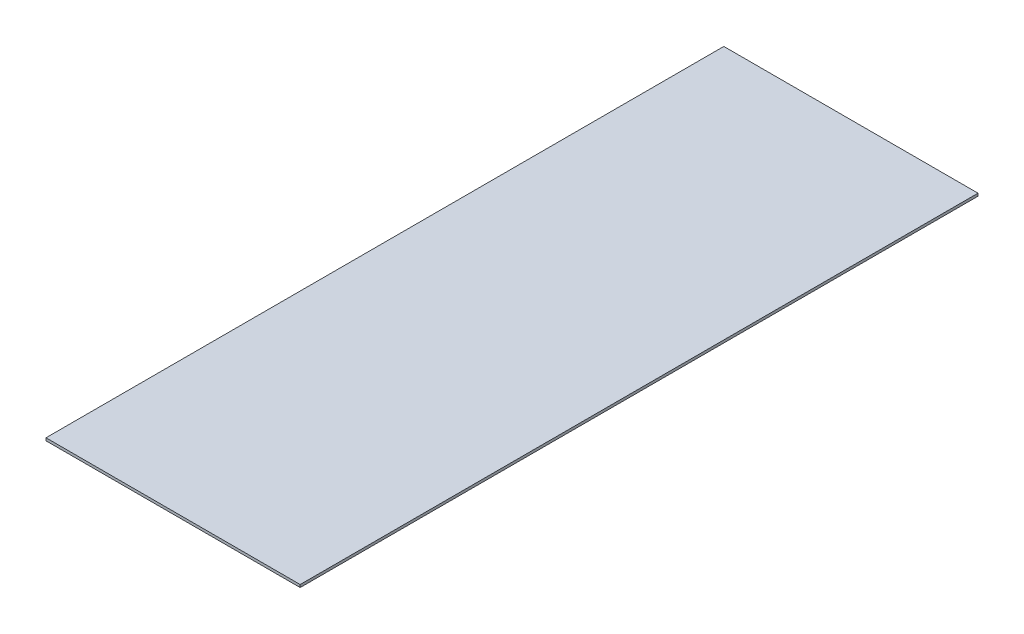
ISO-10303-21;
HEADER;
FILE_DESCRIPTION(('STEP AP214'),'2;1');
FILE_NAME('part.step','',(''),(''),'','','');
FILE_SCHEMA(('AUTOMOTIVE_DESIGN { 1 0 10303 214 1 1 1 1 }'));
ENDSEC;
DATA;
#1=APPLICATION_CONTEXT('core data for automotive mechanical design processes');
#2=APPLICATION_PROTOCOL_DEFINITION('international standard','automotive_design',2000,#1);
#3=PRODUCT_CONTEXT('',#1,'mechanical');
#4=PRODUCT('Part','Part','',(#3));
#5=PRODUCT_RELATED_PRODUCT_CATEGORY('part','',(#4));
#6=PRODUCT_DEFINITION_FORMATION('','',#4);
#7=PRODUCT_DEFINITION_CONTEXT('part definition',#1,'design');
#8=PRODUCT_DEFINITION('design','',#6,#7);
#9=PRODUCT_DEFINITION_SHAPE('','',#8);
#10=(LENGTH_UNIT() NAMED_UNIT(*) SI_UNIT(.MILLI.,.METRE.));
#11=(NAMED_UNIT(*) PLANE_ANGLE_UNIT() SI_UNIT($,.RADIAN.));
#12=(NAMED_UNIT(*) SI_UNIT($,.STERADIAN.) SOLID_ANGLE_UNIT());
#13=UNCERTAINTY_MEASURE_WITH_UNIT(LENGTH_MEASURE(1.E-05),#10,'distance_accuracy_value','');
#14=(GEOMETRIC_REPRESENTATION_CONTEXT(3) GLOBAL_UNCERTAINTY_ASSIGNED_CONTEXT((#13)) GLOBAL_UNIT_ASSIGNED_CONTEXT((#10,
#11,#12)) REPRESENTATION_CONTEXT('',''));
#15=CARTESIAN_POINT('',(0.,0.,0.));
#16=DIRECTION('',(0.,0.,1.));
#17=DIRECTION('',(1.,0.,0.));
#18=AXIS2_PLACEMENT_3D('',#15,#16,#17);
#19=CARTESIAN_POINT('',(457.2,9.5,1219.2));
#20=DIRECTION('',(-1.,0.,0.));
#21=DIRECTION('',(0.,0.,1.));
#22=AXIS2_PLACEMENT_3D('',#19,#20,#21);
#23=PLANE('',#22);
#24=DIRECTION('',(0.,0.,-1.));
#25=VECTOR('',#24,1.);
#26=CARTESIAN_POINT('',(457.2,0.,1219.2));
#27=LINE('',#26,#25);
#28=CARTESIAN_POINT('',(457.2,0.,1219.2));
#29=VERTEX_POINT('',#28);
#30=CARTESIAN_POINT('',(457.2,0.,-1219.2));
#31=VERTEX_POINT('',#30);
#32=EDGE_CURVE('E96',#29,#31,#27,.T.);
#33=ORIENTED_EDGE('',*,*,#32,.T.);
#34=DIRECTION('',(0.,-1.,0.));
#35=VECTOR('',#34,1.);
#36=CARTESIAN_POINT('',(457.2,9.5,-1219.2));
#37=LINE('',#36,#35);
#38=CARTESIAN_POINT('',(457.2,9.5,-1219.2));
#39=VERTEX_POINT('',#38);
#40=EDGE_CURVE('E11',#39,#31,#37,.T.);
#41=ORIENTED_EDGE('',*,*,#40,.F.);
#42=DIRECTION('',(0.,0.,-1.));
#43=VECTOR('',#42,1.);
#44=CARTESIAN_POINT('',(457.2,9.5,1219.2));
#45=LINE('',#44,#43);
#46=CARTESIAN_POINT('',(457.2,9.5,1219.2));
#47=VERTEX_POINT('',#46);
#48=EDGE_CURVE('E84',#47,#39,#45,.T.);
#49=ORIENTED_EDGE('',*,*,#48,.F.);
#50=DIRECTION('',(0.,-1.,0.));
#51=VECTOR('',#50,1.);
#52=CARTESIAN_POINT('',(457.2,9.5,1219.2));
#53=LINE('',#52,#51);
#54=EDGE_CURVE('E92',#47,#29,#53,.T.);
#55=ORIENTED_EDGE('',*,*,#54,.T.);
#56=EDGE_LOOP('',(#33,#41,#49,#55));
#57=FACE_BOUND('',#56,.T.);
#58=ADVANCED_FACE('F33',(#57),#23,.F.);
#59=CARTESIAN_POINT('',(-457.2,9.5,-1219.2));
#60=DIRECTION('',(0.,0.,1.));
#61=DIRECTION('',(1.,0.,0.));
#62=AXIS2_PLACEMENT_3D('',#59,#60,#61);
#63=PLANE('',#62);
#64=DIRECTION('',(-1.,0.,0.));
#65=VECTOR('',#64,1.);
#66=CARTESIAN_POINT('',(-457.2,0.,-1219.2));
#67=LINE('',#66,#65);
#68=CARTESIAN_POINT('',(-457.2,0.,-1219.2));
#69=VERTEX_POINT('',#68);
#70=EDGE_CURVE('E88',#31,#69,#67,.T.);
#71=ORIENTED_EDGE('',*,*,#70,.T.);
#72=DIRECTION('',(0.,-1.,0.));
#73=VECTOR('',#72,1.);
#74=CARTESIAN_POINT('',(-457.2,9.5,-1219.2));
#75=LINE('',#74,#73);
#76=CARTESIAN_POINT('',(-457.2,9.5,-1219.2));
#77=VERTEX_POINT('',#76);
#78=EDGE_CURVE('E41',#77,#69,#75,.T.);
#79=ORIENTED_EDGE('',*,*,#78,.F.);
#80=DIRECTION('',(-1.,0.,0.));
#81=VECTOR('',#80,1.);
#82=CARTESIAN_POINT('',(-457.2,9.5,-1219.2));
#83=LINE('',#82,#81);
#84=EDGE_CURVE('E79',#39,#77,#83,.T.);
#85=ORIENTED_EDGE('',*,*,#84,.F.);
#86=ORIENTED_EDGE('',*,*,#40,.T.);
#87=EDGE_LOOP('',(#71,#79,#85,#86));
#88=FACE_BOUND('',#87,.T.);
#89=ADVANCED_FACE('F87',(#88),#63,.F.);
#90=CARTESIAN_POINT('',(-457.2,9.5,1219.2));
#91=DIRECTION('',(1.,0.,0.));
#92=DIRECTION('',(0.,0.,-1.));
#93=AXIS2_PLACEMENT_3D('',#90,#91,#92);
#94=PLANE('',#93);
#95=DIRECTION('',(0.,0.,1.));
#96=VECTOR('',#95,1.);
#97=CARTESIAN_POINT('',(-457.2,0.,1219.2));
#98=LINE('',#97,#96);
#99=CARTESIAN_POINT('',(-457.2,0.,1219.2));
#100=VERTEX_POINT('',#99);
#101=EDGE_CURVE('E66',#69,#100,#98,.T.);
#102=ORIENTED_EDGE('',*,*,#101,.T.);
#103=DIRECTION('',(0.,-1.,0.));
#104=VECTOR('',#103,1.);
#105=CARTESIAN_POINT('',(-457.2,9.5,1219.2));
#106=LINE('',#105,#104);
#107=CARTESIAN_POINT('',(-457.2,9.5,1219.2));
#108=VERTEX_POINT('',#107);
#109=EDGE_CURVE('E89',#108,#100,#106,.T.);
#110=ORIENTED_EDGE('',*,*,#109,.F.);
#111=DIRECTION('',(0.,0.,1.));
#112=VECTOR('',#111,1.);
#113=CARTESIAN_POINT('',(-457.2,9.5,1219.2));
#114=LINE('',#113,#112);
#115=EDGE_CURVE('E82',#77,#108,#114,.T.);
#116=ORIENTED_EDGE('',*,*,#115,.F.);
#117=ORIENTED_EDGE('',*,*,#78,.T.);
#118=EDGE_LOOP('',(#102,#110,#116,#117));
#119=FACE_BOUND('',#118,.T.);
#120=ADVANCED_FACE('F90',(#119),#94,.F.);
#121=CARTESIAN_POINT('',(-457.2,9.5,1219.2));
#122=DIRECTION('',(0.,0.,-1.));
#123=DIRECTION('',(-1.,0.,0.));
#124=AXIS2_PLACEMENT_3D('',#121,#122,#123);
#125=PLANE('',#124);
#126=DIRECTION('',(1.,0.,0.));
#127=VECTOR('',#126,1.);
#128=CARTESIAN_POINT('',(-457.2,0.,1219.2));
#129=LINE('',#128,#127);
#130=EDGE_CURVE('E72',#100,#29,#129,.T.);
#131=ORIENTED_EDGE('',*,*,#130,.T.);
#132=ORIENTED_EDGE('',*,*,#54,.F.);
#133=DIRECTION('',(1.,0.,0.));
#134=VECTOR('',#133,1.);
#135=CARTESIAN_POINT('',(-457.2,9.5,1219.2));
#136=LINE('',#135,#134);
#137=EDGE_CURVE('E49',#108,#47,#136,.T.);
#138=ORIENTED_EDGE('',*,*,#137,.F.);
#139=ORIENTED_EDGE('',*,*,#109,.T.);
#140=EDGE_LOOP('',(#131,#132,#138,#139));
#141=FACE_BOUND('',#140,.T.);
#142=ADVANCED_FACE('F103',(#141),#125,.F.);
#143=CARTESIAN_POINT('',(0.,9.5,0.));
#144=DIRECTION('',(0.,-1.,0.));
#145=DIRECTION('',(0.,0.,-1.));
#146=AXIS2_PLACEMENT_3D('',#143,#144,#145);
#147=PLANE('',#146);
#148=ORIENTED_EDGE('',*,*,#48,.T.);
#149=ORIENTED_EDGE('',*,*,#84,.T.);
#150=ORIENTED_EDGE('',*,*,#115,.T.);
#151=ORIENTED_EDGE('',*,*,#137,.T.);
#152=EDGE_LOOP('',(#148,#149,#150,#151));
#153=FACE_BOUND('',#152,.T.);
#154=ADVANCED_FACE('F80',(#153),#147,.F.);
#155=CARTESIAN_POINT('',(0.,0.,0.));
#156=DIRECTION('',(0.,-1.,0.));
#157=DIRECTION('',(0.,0.,-1.));
#158=AXIS2_PLACEMENT_3D('',#155,#156,#157);
#159=PLANE('',#158);
#160=ORIENTED_EDGE('',*,*,#32,.F.);
#161=ORIENTED_EDGE('',*,*,#130,.F.);
#162=ORIENTED_EDGE('',*,*,#101,.F.);
#163=ORIENTED_EDGE('',*,*,#70,.F.);
#164=EDGE_LOOP('',(#160,#161,#162,#163));
#165=FACE_BOUND('',#164,.T.);
#166=ADVANCED_FACE('F106',(#165),#159,.T.);
#167=CLOSED_SHELL('',(#58,#89,#120,#142,#154,#166));
#168=MANIFOLD_SOLID_BREP('B2',#167);
#169=ADVANCED_BREP_SHAPE_REPRESENTATION('',(#18,#168),#14);
#170=SHAPE_DEFINITION_REPRESENTATION(#9,#169);
ENDSEC;
END-ISO-10303-21;
